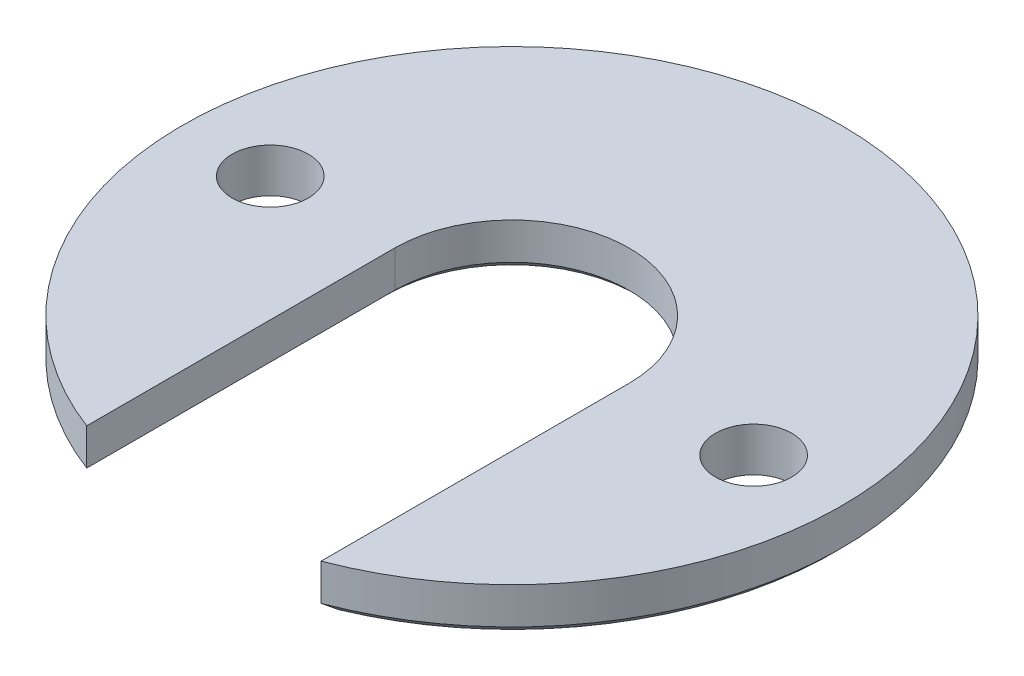
ISO-10303-21;
HEADER;
FILE_DESCRIPTION(('STEP AP214'),'2;1');
FILE_NAME('part.step','',(''),(''),'','','');
FILE_SCHEMA(('AUTOMOTIVE_DESIGN { 1 0 10303 214 1 1 1 1 }'));
ENDSEC;
DATA;
#1=APPLICATION_CONTEXT('core data for automotive mechanical design processes');
#2=APPLICATION_PROTOCOL_DEFINITION('international standard','automotive_design',2000,#1);
#3=PRODUCT_CONTEXT('',#1,'mechanical');
#4=PRODUCT('Part','Part','',(#3));
#5=PRODUCT_RELATED_PRODUCT_CATEGORY('part','',(#4));
#6=PRODUCT_DEFINITION_FORMATION('','',#4);
#7=PRODUCT_DEFINITION_CONTEXT('part definition',#1,'design');
#8=PRODUCT_DEFINITION('design','',#6,#7);
#9=PRODUCT_DEFINITION_SHAPE('','',#8);
#10=(LENGTH_UNIT() NAMED_UNIT(*) SI_UNIT(.MILLI.,.METRE.));
#11=(NAMED_UNIT(*) PLANE_ANGLE_UNIT() SI_UNIT($,.RADIAN.));
#12=(NAMED_UNIT(*) SI_UNIT($,.STERADIAN.) SOLID_ANGLE_UNIT());
#13=UNCERTAINTY_MEASURE_WITH_UNIT(LENGTH_MEASURE(1.E-05),#10,'distance_accuracy_value','');
#14=(GEOMETRIC_REPRESENTATION_CONTEXT(3) GLOBAL_UNCERTAINTY_ASSIGNED_CONTEXT((#13)) GLOBAL_UNIT_ASSIGNED_CONTEXT((#10,
#11,#12)) REPRESENTATION_CONTEXT('',''));
#15=CARTESIAN_POINT('',(0.,0.,0.));
#16=DIRECTION('',(0.,0.,1.));
#17=DIRECTION('',(1.,0.,0.));
#18=AXIS2_PLACEMENT_3D('',#15,#16,#17);
#19=CARTESIAN_POINT('',(8.00000000000001,3.,0.));
#20=DIRECTION('',(1.,0.,0.));
#21=DIRECTION('',(0.,0.,-1.));
#22=AXIS2_PLACEMENT_3D('',#19,#20,#21);
#23=PLANE('',#22);
#24=DIRECTION('',(0.,0.,1.));
#25=VECTOR('',#24,1.);
#26=CARTESIAN_POINT('',(8.00000000000001,3.,0.));
#27=LINE('',#26,#25);
#28=CARTESIAN_POINT('',(8.,3.,0.));
#29=VERTEX_POINT('',#28);
#30=CARTESIAN_POINT('',(8.00000000000002,3.,21.0297408448131));
#31=VERTEX_POINT('',#30);
#32=EDGE_CURVE('E12',#29,#31,#27,.T.);
#33=ORIENTED_EDGE('',*,*,#32,.F.);
#34=DIRECTION('',(0.,-1.,0.));
#35=VECTOR('',#34,1.);
#36=CARTESIAN_POINT('',(8.,3.,0.));
#37=LINE('',#36,#35);
#38=CARTESIAN_POINT('',(8.,0.5,0.));
#39=VERTEX_POINT('',#38);
#40=EDGE_CURVE('E155',#29,#39,#37,.T.);
#41=ORIENTED_EDGE('',*,*,#40,.T.);
#42=DIRECTION('',(0.,0.,1.));
#43=VECTOR('',#42,1.);
#44=CARTESIAN_POINT('',(8.00000000000002,0.5,21.0297408448131));
#45=LINE('',#44,#43);
#46=CARTESIAN_POINT('',(8.00000000000002,0.5,21.0297408448131));
#47=VERTEX_POINT('',#46);
#48=EDGE_CURVE('E178',#39,#47,#45,.T.);
#49=ORIENTED_EDGE('',*,*,#48,.T.);
#50=DIRECTION('',(0.,1.,0.));
#51=VECTOR('',#50,1.);
#52=CARTESIAN_POINT('',(8.00000000000002,3.,21.0297408448131));
#53=LINE('',#52,#51);
#54=EDGE_CURVE('E162',#31,#47,#53,.F.);
#55=ORIENTED_EDGE('',*,*,#54,.F.);
#56=EDGE_LOOP('',(#33,#41,#49,#55));
#57=FACE_BOUND('',#56,.T.);
#58=ADVANCED_FACE('F34',(#57),#23,.F.);
#59=CARTESIAN_POINT('',(0.,3.,0.));
#60=DIRECTION('',(0.,-1.,0.));
#61=DIRECTION('',(0.,0.,-1.));
#62=AXIS2_PLACEMENT_3D('',#59,#60,#61);
#63=CYLINDRICAL_SURFACE('',#62,8.);
#64=CARTESIAN_POINT('',(0.,3.,0.));
#65=DIRECTION('',(0.,-1.,0.));
#66=DIRECTION('',(0.,0.,-1.));
#67=AXIS2_PLACEMENT_3D('',#64,#65,#66);
#68=CIRCLE('',#67,8.);
#69=CARTESIAN_POINT('',(-8.,3.,0.));
#70=VERTEX_POINT('',#69);
#71=EDGE_CURVE('E42',#70,#29,#68,.T.);
#72=ORIENTED_EDGE('',*,*,#71,.F.);
#73=DIRECTION('',(0.,1.,0.));
#74=VECTOR('',#73,1.);
#75=CARTESIAN_POINT('',(-8.,3.,0.));
#76=LINE('',#75,#74);
#77=CARTESIAN_POINT('',(-8.,0.5,0.));
#78=VERTEX_POINT('',#77);
#79=EDGE_CURVE('E161',#70,#78,#76,.F.);
#80=ORIENTED_EDGE('',*,*,#79,.T.);
#81=CARTESIAN_POINT('',(0.,0.5,0.));
#82=DIRECTION('',(0.,-1.,0.));
#83=DIRECTION('',(0.,0.,-1.));
#84=AXIS2_PLACEMENT_3D('',#81,#82,#83);
#85=CIRCLE('',#84,8.);
#86=EDGE_CURVE('E158',#78,#39,#85,.T.);
#87=ORIENTED_EDGE('',*,*,#86,.T.);
#88=ORIENTED_EDGE('',*,*,#40,.F.);
#89=EDGE_LOOP('',(#72,#80,#87,#88));
#90=FACE_BOUND('',#89,.T.);
#91=ADVANCED_FACE('F156',(#90),#63,.F.);
#92=CARTESIAN_POINT('',(-8.,3.,0.));
#93=DIRECTION('',(-1.,0.,0.));
#94=DIRECTION('',(0.,0.,1.));
#95=AXIS2_PLACEMENT_3D('',#92,#93,#94);
#96=PLANE('',#95);
#97=DIRECTION('',(0.,0.,-1.));
#98=VECTOR('',#97,1.);
#99=CARTESIAN_POINT('',(-8.,3.,0.));
#100=LINE('',#99,#98);
#101=CARTESIAN_POINT('',(-7.99999999999999,3.,21.0297408448131));
#102=VERTEX_POINT('',#101);
#103=EDGE_CURVE('E116',#102,#70,#100,.T.);
#104=ORIENTED_EDGE('',*,*,#103,.F.);
#105=DIRECTION('',(0.,1.,0.));
#106=VECTOR('',#105,1.);
#107=CARTESIAN_POINT('',(-8.,3.,21.0297408448131));
#108=LINE('',#107,#106);
#109=CARTESIAN_POINT('',(-8.,0.5,21.0297408448131));
#110=VERTEX_POINT('',#109);
#111=EDGE_CURVE('E164',#110,#102,#108,.T.);
#112=ORIENTED_EDGE('',*,*,#111,.F.);
#113=DIRECTION('',(0.,0.,-1.));
#114=VECTOR('',#113,1.);
#115=CARTESIAN_POINT('',(-8.,0.5,0.));
#116=LINE('',#115,#114);
#117=EDGE_CURVE('E93',#110,#78,#116,.T.);
#118=ORIENTED_EDGE('',*,*,#117,.T.);
#119=ORIENTED_EDGE('',*,*,#79,.F.);
#120=EDGE_LOOP('',(#104,#112,#118,#119));
#121=FACE_BOUND('',#120,.T.);
#122=ADVANCED_FACE('F36',(#121),#96,.F.);
#123=CARTESIAN_POINT('',(0.,3.,0.));
#124=DIRECTION('',(0.,-1.,0.));
#125=DIRECTION('',(0.,0.,-1.));
#126=AXIS2_PLACEMENT_3D('',#123,#124,#125);
#127=CYLINDRICAL_SURFACE('',#126,22.5);
#128=ORIENTED_EDGE('',*,*,#111,.T.);
#129=CARTESIAN_POINT('',(0.,3.,0.));
#130=DIRECTION('',(0.,-1.,0.));
#131=DIRECTION('',(0.,0.,-1.));
#132=AXIS2_PLACEMENT_3D('',#129,#130,#131);
#133=CIRCLE('',#132,22.5);
#134=EDGE_CURVE('E113',#102,#31,#133,.T.);
#135=ORIENTED_EDGE('',*,*,#134,.T.);
#136=ORIENTED_EDGE('',*,*,#54,.T.);
#137=CARTESIAN_POINT('',(0.,0.5,0.));
#138=DIRECTION('',(0.,-1.,0.));
#139=DIRECTION('',(0.,0.,-1.));
#140=AXIS2_PLACEMENT_3D('',#137,#138,#139);
#141=CIRCLE('',#140,22.5);
#142=EDGE_CURVE('E107',#47,#110,#141,.F.);
#143=ORIENTED_EDGE('',*,*,#142,.T.);
#144=EDGE_LOOP('',(#128,#135,#136,#143));
#145=FACE_BOUND('',#144,.T.);
#146=ADVANCED_FACE('F186',(#145),#127,.T.);
#147=CARTESIAN_POINT('',(0.,0.,0.));
#148=DIRECTION('',(0.,-1.,0.));
#149=DIRECTION('',(0.,0.,-1.));
#150=AXIS2_PLACEMENT_3D('',#147,#148,#149);
#151=PLANE('',#150);
#152=CARTESIAN_POINT('',(0.,0.,0.));
#153=DIRECTION('',(0.,-1.,0.));
#154=DIRECTION('',(0.,0.,-1.));
#155=AXIS2_PLACEMENT_3D('',#152,#153,#154);
#156=CIRCLE('',#155,8.49999999999999);
#157=CARTESIAN_POINT('',(8.5,0.,0.));
#158=VERTEX_POINT('',#157);
#159=CARTESIAN_POINT('',(-8.49999999999999,0.,0.));
#160=VERTEX_POINT('',#159);
#161=EDGE_CURVE('E112',#158,#160,#156,.F.);
#162=ORIENTED_EDGE('',*,*,#161,.T.);
#163=DIRECTION('',(0.,0.,1.));
#164=VECTOR('',#163,1.);
#165=CARTESIAN_POINT('',(-8.49999999999999,0.,21.0297408448131));
#166=LINE('',#165,#164);
#167=CARTESIAN_POINT('',(-8.49999999999999,0.,20.291623887703));
#168=VERTEX_POINT('',#167);
#169=EDGE_CURVE('E90',#160,#168,#166,.T.);
#170=ORIENTED_EDGE('',*,*,#169,.T.);
#171=CARTESIAN_POINT('',(0.,0.,0.));
#172=DIRECTION('',(0.,-1.,0.));
#173=DIRECTION('',(0.,0.,-1.));
#174=AXIS2_PLACEMENT_3D('',#171,#172,#173);
#175=CIRCLE('',#174,22.);
#176=CARTESIAN_POINT('',(8.50000000000001,0.,20.291623887703));
#177=VERTEX_POINT('',#176);
#178=EDGE_CURVE('E100',#168,#177,#175,.T.);
#179=ORIENTED_EDGE('',*,*,#178,.T.);
#180=DIRECTION('',(0.,0.,-1.));
#181=VECTOR('',#180,1.);
#182=CARTESIAN_POINT('',(8.5,0.,0.));
#183=LINE('',#182,#181);
#184=EDGE_CURVE('E106',#177,#158,#183,.T.);
#185=ORIENTED_EDGE('',*,*,#184,.T.);
#186=EDGE_LOOP('',(#162,#170,#179,#185));
#187=FACE_BOUND('',#186,.T.);
#188=CARTESIAN_POINT('',(-16.5,0.,0.));
#189=DIRECTION('',(0.,-1.,0.));
#190=DIRECTION('',(0.,0.,-1.));
#191=AXIS2_PLACEMENT_3D('',#188,#189,#190);
#192=CIRCLE('',#191,2.6);
#193=CARTESIAN_POINT('',(-16.5,0.,-2.6));
#194=VERTEX_POINT('',#193);
#195=EDGE_CURVE('E173',#194,#194,#192,.T.);
#196=ORIENTED_EDGE('',*,*,#195,.F.);
#197=EDGE_LOOP('',(#196));
#198=FACE_BOUND('',#197,.T.);
#199=CARTESIAN_POINT('',(16.5,0.,0.));
#200=DIRECTION('',(0.,-1.,0.));
#201=DIRECTION('',(0.,0.,-1.));
#202=AXIS2_PLACEMENT_3D('',#199,#200,#201);
#203=CIRCLE('',#202,2.6);
#204=CARTESIAN_POINT('',(16.5,0.,-2.6));
#205=VERTEX_POINT('',#204);
#206=EDGE_CURVE('E148',#205,#205,#203,.T.);
#207=ORIENTED_EDGE('',*,*,#206,.F.);
#208=EDGE_LOOP('',(#207));
#209=FACE_BOUND('',#208,.T.);
#210=ADVANCED_FACE('F109',(#187,#198,#209),#151,.T.);
#211=CARTESIAN_POINT('',(0.,3.,0.));
#212=DIRECTION('',(0.,-1.,0.));
#213=DIRECTION('',(0.,0.,-1.));
#214=AXIS2_PLACEMENT_3D('',#211,#212,#213);
#215=PLANE('',#214);
#216=ORIENTED_EDGE('',*,*,#71,.T.);
#217=ORIENTED_EDGE('',*,*,#32,.T.);
#218=ORIENTED_EDGE('',*,*,#134,.F.);
#219=ORIENTED_EDGE('',*,*,#103,.T.);
#220=EDGE_LOOP('',(#216,#217,#218,#219));
#221=FACE_BOUND('',#220,.T.);
#222=CARTESIAN_POINT('',(-16.5,3.,0.));
#223=DIRECTION('',(0.,-1.,0.));
#224=DIRECTION('',(0.,0.,-1.));
#225=AXIS2_PLACEMENT_3D('',#222,#223,#224);
#226=CIRCLE('',#225,2.6);
#227=CARTESIAN_POINT('',(-16.5,3.,-2.6));
#228=VERTEX_POINT('',#227);
#229=EDGE_CURVE('E166',#228,#228,#226,.T.);
#230=ORIENTED_EDGE('',*,*,#229,.T.);
#231=EDGE_LOOP('',(#230));
#232=FACE_BOUND('',#231,.T.);
#233=CARTESIAN_POINT('',(16.5,3.,0.));
#234=DIRECTION('',(0.,-1.,0.));
#235=DIRECTION('',(0.,0.,-1.));
#236=AXIS2_PLACEMENT_3D('',#233,#234,#235);
#237=CIRCLE('',#236,2.6);
#238=CARTESIAN_POINT('',(16.5,3.,-2.6));
#239=VERTEX_POINT('',#238);
#240=EDGE_CURVE('E170',#239,#239,#237,.T.);
#241=ORIENTED_EDGE('',*,*,#240,.T.);
#242=EDGE_LOOP('',(#241));
#243=FACE_BOUND('',#242,.T.);
#244=ADVANCED_FACE('F143',(#221,#232,#243),#215,.F.);
#245=CARTESIAN_POINT('',(16.5,60.,0.));
#246=DIRECTION('',(0.,-1.,0.));
#247=DIRECTION('',(0.,0.,-1.));
#248=AXIS2_PLACEMENT_3D('',#245,#246,#247);
#249=CYLINDRICAL_SURFACE('',#248,2.6);
#250=CARTESIAN_POINT('',(16.5,0.,-2.6));
#251=CARTESIAN_POINT('',(16.5,0.0312500000000012,-2.6));
#252=CARTESIAN_POINT('',(16.5,0.0625000000000024,-2.6));
#253=CARTESIAN_POINT('',(16.5,0.125000000000002,-2.6));
#254=CARTESIAN_POINT('',(16.5,0.156250000000001,-2.6));
#255=CARTESIAN_POINT('',(16.5,0.218749999999999,-2.6));
#256=CARTESIAN_POINT('',(16.5,0.249999999999998,-2.6));
#257=CARTESIAN_POINT('',(16.5,0.312499999999998,-2.6));
#258=CARTESIAN_POINT('',(16.5,0.343749999999999,-2.6));
#259=CARTESIAN_POINT('',(16.5,0.406250000000001,-2.6));
#260=CARTESIAN_POINT('',(16.5,0.437500000000003,-2.6));
#261=CARTESIAN_POINT('',(16.5,0.500000000000003,-2.6));
#262=CARTESIAN_POINT('',(16.5,0.531250000000002,-2.6));
#263=CARTESIAN_POINT('',(16.5,0.593749999999999,-2.6));
#264=CARTESIAN_POINT('',(16.5,0.624999999999998,-2.6));
#265=CARTESIAN_POINT('',(16.5,0.687499999999998,-2.6));
#266=CARTESIAN_POINT('',(16.5,0.718749999999999,-2.6));
#267=CARTESIAN_POINT('',(16.5,0.781250000000002,-2.6));
#268=CARTESIAN_POINT('',(16.5,0.812500000000003,-2.6));
#269=CARTESIAN_POINT('',(16.5,0.875000000000003,-2.6));
#270=CARTESIAN_POINT('',(16.5,0.906250000000002,-2.6));
#271=CARTESIAN_POINT('',(16.5,0.96875,-2.6));
#272=CARTESIAN_POINT('',(16.5,0.999999999999999,-2.6));
#273=CARTESIAN_POINT('',(16.5,1.0625,-2.6));
#274=CARTESIAN_POINT('',(16.5,1.09375,-2.6));
#275=CARTESIAN_POINT('',(16.5,1.15625,-2.6));
#276=CARTESIAN_POINT('',(16.5,1.1875,-2.6));
#277=CARTESIAN_POINT('',(16.5,1.25,-2.6));
#278=CARTESIAN_POINT('',(16.5,1.28125,-2.6));
#279=CARTESIAN_POINT('',(16.5,1.34375,-2.6));
#280=CARTESIAN_POINT('',(16.5,1.375,-2.6));
#281=CARTESIAN_POINT('',(16.5,1.4375,-2.6));
#282=CARTESIAN_POINT('',(16.5,1.46875,-2.6));
#283=CARTESIAN_POINT('',(16.5,1.53125,-2.6));
#284=CARTESIAN_POINT('',(16.5,1.5625,-2.6));
#285=CARTESIAN_POINT('',(16.5,1.625,-2.6));
#286=CARTESIAN_POINT('',(16.5,1.65625,-2.6));
#287=CARTESIAN_POINT('',(16.5,1.71875,-2.6));
#288=CARTESIAN_POINT('',(16.5,1.75,-2.6));
#289=CARTESIAN_POINT('',(16.5,1.8125,-2.6));
#290=CARTESIAN_POINT('',(16.5,1.84375,-2.6));
#291=CARTESIAN_POINT('',(16.5,1.90625,-2.6));
#292=CARTESIAN_POINT('',(16.5,1.9375,-2.6));
#293=CARTESIAN_POINT('',(16.5,2.,-2.6));
#294=CARTESIAN_POINT('',(16.5,2.03125,-2.6));
#295=CARTESIAN_POINT('',(16.5,2.09375,-2.6));
#296=CARTESIAN_POINT('',(16.5,2.125,-2.6));
#297=CARTESIAN_POINT('',(16.5,2.1875,-2.6));
#298=CARTESIAN_POINT('',(16.5,2.21875,-2.6));
#299=CARTESIAN_POINT('',(16.5,2.28125,-2.6));
#300=CARTESIAN_POINT('',(16.5,2.3125,-2.6));
#301=CARTESIAN_POINT('',(16.5,2.375,-2.6));
#302=CARTESIAN_POINT('',(16.5,2.40625,-2.6));
#303=CARTESIAN_POINT('',(16.5,2.46875,-2.6));
#304=CARTESIAN_POINT('',(16.5,2.5,-2.6));
#305=CARTESIAN_POINT('',(16.5,2.5625,-2.6));
#306=CARTESIAN_POINT('',(16.5,2.59375,-2.6));
#307=CARTESIAN_POINT('',(16.5,2.65625,-2.6));
#308=CARTESIAN_POINT('',(16.5,2.6875,-2.6));
#309=CARTESIAN_POINT('',(16.5,2.75,-2.6));
#310=CARTESIAN_POINT('',(16.5,2.78125,-2.6));
#311=CARTESIAN_POINT('',(16.5,2.84375,-2.6));
#312=CARTESIAN_POINT('',(16.5,2.875,-2.6));
#313=CARTESIAN_POINT('',(16.5,2.9375,-2.6));
#314=CARTESIAN_POINT('',(16.5,2.96875,-2.6));
#315=CARTESIAN_POINT('',(16.5,3.,-2.6));
#316=B_SPLINE_CURVE_WITH_KNOTS('',3,(#250,#251,#252,#253,#254,#255,#256,#257,#258,#259,#260,
#261,#262,#263,#264,#265,#266,#267,#268,#269,#270,#271,#272,#273,#274,#275,#276,#277,#278,#279,
#280,#281,#282,#283,#284,#285,#286,#287,#288,#289,#290,#291,#292,#293,#294,#295,#296,#297,#298,
#299,#300,#301,#302,#303,#304,#305,#306,#307,#308,#309,#310,#311,#312,#313,#314,#315),
.UNSPECIFIED.,.F.,.F.,(4,2,2,2,2,2,2,2,2,2,2,2,2,2,2,2,2,2,2,2,2,2,2,2,2,2,2,2,2,2,2,2,4),(0.,
0.0937500000000036,0.1875,0.281249999999997,0.375,0.468750000000004,0.5625,0.656249999999997,
0.750000000000001,0.843750000000004,0.937500000000001,1.03125,1.125,1.21875,1.3125,1.40625,1.5,
1.59375,1.6875,1.78125,1.875,1.96875000000001,2.0625,2.15625,2.25,2.34375000000001,2.4375,
2.53125,2.625,2.71875000000001,2.8125,2.90625,3.),.UNSPECIFIED.);
#317=EDGE_CURVE('BSEAM198',#205,#239,#316,.T.);
#318=ORIENTED_EDGE('',*,*,#206,.T.);
#319=ORIENTED_EDGE('',*,*,#240,.F.);
#320=ORIENTED_EDGE('',*,*,#317,.T.);
#321=ORIENTED_EDGE('',*,*,#317,.F.);
#322=EDGE_LOOP('',(#318,#320,#319,#321));
#323=FACE_BOUND('',#322,.T.);
#324=ADVANCED_FACE('F198',(#323),#249,.F.);
#325=CARTESIAN_POINT('',(-16.5,60.,0.));
#326=DIRECTION('',(0.,-1.,0.));
#327=DIRECTION('',(0.,0.,-1.));
#328=AXIS2_PLACEMENT_3D('',#325,#326,#327);
#329=CYLINDRICAL_SURFACE('',#328,2.6);
#330=CARTESIAN_POINT('',(-16.5,0.,-2.6));
#331=CARTESIAN_POINT('',(-16.5,0.0312500000000012,-2.6));
#332=CARTESIAN_POINT('',(-16.5,0.0625000000000024,-2.6));
#333=CARTESIAN_POINT('',(-16.5,0.125000000000002,-2.6));
#334=CARTESIAN_POINT('',(-16.5,0.156250000000001,-2.6));
#335=CARTESIAN_POINT('',(-16.5,0.218749999999999,-2.6));
#336=CARTESIAN_POINT('',(-16.5,0.249999999999998,-2.6));
#337=CARTESIAN_POINT('',(-16.5,0.312499999999998,-2.6));
#338=CARTESIAN_POINT('',(-16.5,0.343749999999999,-2.6));
#339=CARTESIAN_POINT('',(-16.5,0.406250000000001,-2.6));
#340=CARTESIAN_POINT('',(-16.5,0.437500000000003,-2.6));
#341=CARTESIAN_POINT('',(-16.5,0.500000000000003,-2.6));
#342=CARTESIAN_POINT('',(-16.5,0.531250000000002,-2.6));
#343=CARTESIAN_POINT('',(-16.5,0.593749999999999,-2.6));
#344=CARTESIAN_POINT('',(-16.5,0.624999999999998,-2.6));
#345=CARTESIAN_POINT('',(-16.5,0.687499999999998,-2.6));
#346=CARTESIAN_POINT('',(-16.5,0.718749999999999,-2.6));
#347=CARTESIAN_POINT('',(-16.5,0.781250000000002,-2.6));
#348=CARTESIAN_POINT('',(-16.5,0.812500000000003,-2.6));
#349=CARTESIAN_POINT('',(-16.5,0.875000000000003,-2.6));
#350=CARTESIAN_POINT('',(-16.5,0.906250000000002,-2.6));
#351=CARTESIAN_POINT('',(-16.5,0.96875,-2.6));
#352=CARTESIAN_POINT('',(-16.5,0.999999999999999,-2.6));
#353=CARTESIAN_POINT('',(-16.5,1.0625,-2.6));
#354=CARTESIAN_POINT('',(-16.5,1.09375,-2.6));
#355=CARTESIAN_POINT('',(-16.5,1.15625,-2.6));
#356=CARTESIAN_POINT('',(-16.5,1.1875,-2.6));
#357=CARTESIAN_POINT('',(-16.5,1.25,-2.6));
#358=CARTESIAN_POINT('',(-16.5,1.28125,-2.6));
#359=CARTESIAN_POINT('',(-16.5,1.34375,-2.6));
#360=CARTESIAN_POINT('',(-16.5,1.375,-2.6));
#361=CARTESIAN_POINT('',(-16.5,1.4375,-2.6));
#362=CARTESIAN_POINT('',(-16.5,1.46875,-2.6));
#363=CARTESIAN_POINT('',(-16.5,1.53125,-2.6));
#364=CARTESIAN_POINT('',(-16.5,1.5625,-2.6));
#365=CARTESIAN_POINT('',(-16.5,1.625,-2.6));
#366=CARTESIAN_POINT('',(-16.5,1.65625,-2.6));
#367=CARTESIAN_POINT('',(-16.5,1.71875,-2.6));
#368=CARTESIAN_POINT('',(-16.5,1.75,-2.6));
#369=CARTESIAN_POINT('',(-16.5,1.8125,-2.6));
#370=CARTESIAN_POINT('',(-16.5,1.84375,-2.6));
#371=CARTESIAN_POINT('',(-16.5,1.90625,-2.6));
#372=CARTESIAN_POINT('',(-16.5,1.9375,-2.6));
#373=CARTESIAN_POINT('',(-16.5,2.,-2.6));
#374=CARTESIAN_POINT('',(-16.5,2.03125,-2.6));
#375=CARTESIAN_POINT('',(-16.5,2.09375,-2.6));
#376=CARTESIAN_POINT('',(-16.5,2.125,-2.6));
#377=CARTESIAN_POINT('',(-16.5,2.1875,-2.6));
#378=CARTESIAN_POINT('',(-16.5,2.21875,-2.6));
#379=CARTESIAN_POINT('',(-16.5,2.28125,-2.6));
#380=CARTESIAN_POINT('',(-16.5,2.3125,-2.6));
#381=CARTESIAN_POINT('',(-16.5,2.375,-2.6));
#382=CARTESIAN_POINT('',(-16.5,2.40625,-2.6));
#383=CARTESIAN_POINT('',(-16.5,2.46875,-2.6));
#384=CARTESIAN_POINT('',(-16.5,2.5,-2.6));
#385=CARTESIAN_POINT('',(-16.5,2.5625,-2.6));
#386=CARTESIAN_POINT('',(-16.5,2.59375,-2.6));
#387=CARTESIAN_POINT('',(-16.5,2.65625,-2.6));
#388=CARTESIAN_POINT('',(-16.5,2.6875,-2.6));
#389=CARTESIAN_POINT('',(-16.5,2.75,-2.6));
#390=CARTESIAN_POINT('',(-16.5,2.78125,-2.6));
#391=CARTESIAN_POINT('',(-16.5,2.84375,-2.6));
#392=CARTESIAN_POINT('',(-16.5,2.875,-2.6));
#393=CARTESIAN_POINT('',(-16.5,2.9375,-2.6));
#394=CARTESIAN_POINT('',(-16.5,2.96875,-2.6));
#395=CARTESIAN_POINT('',(-16.5,3.,-2.6));
#396=B_SPLINE_CURVE_WITH_KNOTS('',3,(#330,#331,#332,#333,#334,#335,#336,#337,#338,#339,#340,
#341,#342,#343,#344,#345,#346,#347,#348,#349,#350,#351,#352,#353,#354,#355,#356,#357,#358,#359,
#360,#361,#362,#363,#364,#365,#366,#367,#368,#369,#370,#371,#372,#373,#374,#375,#376,#377,#378,
#379,#380,#381,#382,#383,#384,#385,#386,#387,#388,#389,#390,#391,#392,#393,#394,#395),
.UNSPECIFIED.,.F.,.F.,(4,2,2,2,2,2,2,2,2,2,2,2,2,2,2,2,2,2,2,2,2,2,2,2,2,2,2,2,2,2,2,2,4),(0.,
0.0937500000000036,0.1875,0.281249999999997,0.375,0.468750000000004,0.5625,0.656249999999997,
0.750000000000001,0.843750000000004,0.937500000000001,1.03125,1.125,1.21875,1.3125,1.40625,1.5,
1.59375,1.6875,1.78125,1.875,1.96875000000001,2.0625,2.15625,2.25,2.34375000000001,2.4375,
2.53125,2.625,2.71875000000001,2.8125,2.90625,3.),.UNSPECIFIED.);
#397=EDGE_CURVE('BSEAM141',#194,#228,#396,.T.);
#398=ORIENTED_EDGE('',*,*,#195,.T.);
#399=ORIENTED_EDGE('',*,*,#229,.F.);
#400=ORIENTED_EDGE('',*,*,#397,.T.);
#401=ORIENTED_EDGE('',*,*,#397,.F.);
#402=EDGE_LOOP('',(#398,#400,#399,#401));
#403=FACE_BOUND('',#402,.T.);
#404=ADVANCED_FACE('F141',(#403),#329,.F.);
#405=CARTESIAN_POINT('',(8.00000000000001,0.5,0.));
#406=DIRECTION('',(-0.707106781186552,-0.707106781186543,0.));
#407=DIRECTION('',(0.,0.,-1.));
#408=AXIS2_PLACEMENT_3D('',#405,#406,#407);
#409=PLANE('',#408);
#410=DIRECTION('',(-0.707106781186543,0.707106781186552,0.));
#411=VECTOR('',#410,1.);
#412=CARTESIAN_POINT('',(8.5,0.,0.));
#413=LINE('',#412,#411);
#414=EDGE_CURVE('E96',#158,#39,#413,.T.);
#415=ORIENTED_EDGE('',*,*,#414,.F.);
#416=ORIENTED_EDGE('',*,*,#184,.F.);
#417=CARTESIAN_POINT('',(8.00000000000002,0.5,21.0297408448131));
#418=CARTESIAN_POINT('',(8.08410951092809,0.415890489071935,20.9077729692418));
#419=CARTESIAN_POINT('',(8.16783092382559,0.332169076174433,20.7852792989065));
#420=CARTESIAN_POINT('',(8.33449759083949,0.165502409160527,20.5392403136736));
#421=CARTESIAN_POINT('',(8.41744284460865,0.0825571553913629,20.4156949983056));
#422=CARTESIAN_POINT('',(8.50000000000001,0.,20.291623887703));
#423=B_SPLINE_CURVE_WITH_KNOTS('',3,(#417,#418,#419,#420,#421,#422),.UNSPECIFIED.,.F.,.F.,(4,2,
4),(0.,0.511086336195741,1.02217290103128),.UNSPECIFIED.);
#424=EDGE_CURVE('E103',#47,#177,#423,.T.);
#425=ORIENTED_EDGE('',*,*,#424,.F.);
#426=ORIENTED_EDGE('',*,*,#48,.F.);
#427=EDGE_LOOP('',(#415,#416,#425,#426));
#428=FACE_BOUND('',#427,.T.);
#429=ADVANCED_FACE('F137',(#428),#409,.T.);
#430=CARTESIAN_POINT('',(0.,0.5,0.));
#431=DIRECTION('',(0.,1.,0.));
#432=DIRECTION('',(0.,0.,1.));
#433=AXIS2_PLACEMENT_3D('',#430,#431,#432);
#434=CONICAL_SURFACE('',#433,22.5,0.785398163397441);
#435=ORIENTED_EDGE('',*,*,#424,.T.);
#436=ORIENTED_EDGE('',*,*,#178,.F.);
#437=CARTESIAN_POINT('',(-8.49999999999999,0.,20.291623887703));
#438=CARTESIAN_POINT('',(-8.41744284460863,0.0825571553913608,20.4156949983056));
#439=CARTESIAN_POINT('',(-8.33449759083947,0.165502409160525,20.5392403136736));
#440=CARTESIAN_POINT('',(-8.16783092382556,0.332169076174432,20.7852792989065));
#441=CARTESIAN_POINT('',(-8.08410951092806,0.415890489071936,20.9077729692419));
#442=CARTESIAN_POINT('',(-7.99999999999999,0.500000000000003,21.0297408448131));
#443=B_SPLINE_CURVE_WITH_KNOTS('',3,(#437,#438,#439,#440,#441,#442),.UNSPECIFIED.,.F.,.F.,(4,2,
4),(0.,0.511086564835541,1.02217290103128),.UNSPECIFIED.);
#444=EDGE_CURVE('E85',#110,#168,#443,.F.);
#445=ORIENTED_EDGE('',*,*,#444,.F.);
#446=ORIENTED_EDGE('',*,*,#142,.F.);
#447=EDGE_LOOP('',(#435,#436,#445,#446));
#448=FACE_BOUND('',#447,.T.);
#449=ADVANCED_FACE('F101',(#448),#434,.T.);
#450=CARTESIAN_POINT('',(0.,0.5,0.));
#451=DIRECTION('',(0.,-1.,0.));
#452=DIRECTION('',(0.,0.,-1.));
#453=AXIS2_PLACEMENT_3D('',#450,#451,#452);
#454=CONICAL_SURFACE('',#453,8.,0.785398163397441);
#455=ORIENTED_EDGE('',*,*,#414,.T.);
#456=ORIENTED_EDGE('',*,*,#86,.F.);
#457=DIRECTION('',(0.707106781186543,0.707106781186552,0.));
#458=VECTOR('',#457,1.);
#459=CARTESIAN_POINT('',(-8.49999999999999,0.,0.));
#460=LINE('',#459,#458);
#461=EDGE_CURVE('E97',#160,#78,#460,.T.);
#462=ORIENTED_EDGE('',*,*,#461,.F.);
#463=ORIENTED_EDGE('',*,*,#161,.F.);
#464=EDGE_LOOP('',(#455,#456,#462,#463));
#465=FACE_BOUND('',#464,.T.);
#466=ADVANCED_FACE('F133',(#465),#454,.F.);
#467=CARTESIAN_POINT('',(-8.,0.5,0.));
#468=DIRECTION('',(0.707106781186552,-0.707106781186543,0.));
#469=DIRECTION('',(0.,0.,1.));
#470=AXIS2_PLACEMENT_3D('',#467,#468,#469);
#471=PLANE('',#470);
#472=ORIENTED_EDGE('',*,*,#444,.T.);
#473=ORIENTED_EDGE('',*,*,#169,.F.);
#474=ORIENTED_EDGE('',*,*,#461,.T.);
#475=ORIENTED_EDGE('',*,*,#117,.F.);
#476=EDGE_LOOP('',(#472,#473,#474,#475));
#477=FACE_BOUND('',#476,.T.);
#478=ADVANCED_FACE('F87',(#477),#471,.T.);
#479=CLOSED_SHELL('',(#58,#91,#122,#146,#210,#244,#324,#404,#429,#449,#466,#478));
#480=MANIFOLD_SOLID_BREP('B2',#479);
#481=ADVANCED_BREP_SHAPE_REPRESENTATION('',(#18,#480),#14);
#482=SHAPE_DEFINITION_REPRESENTATION(#9,#481);
ENDSEC;
END-ISO-10303-21;
